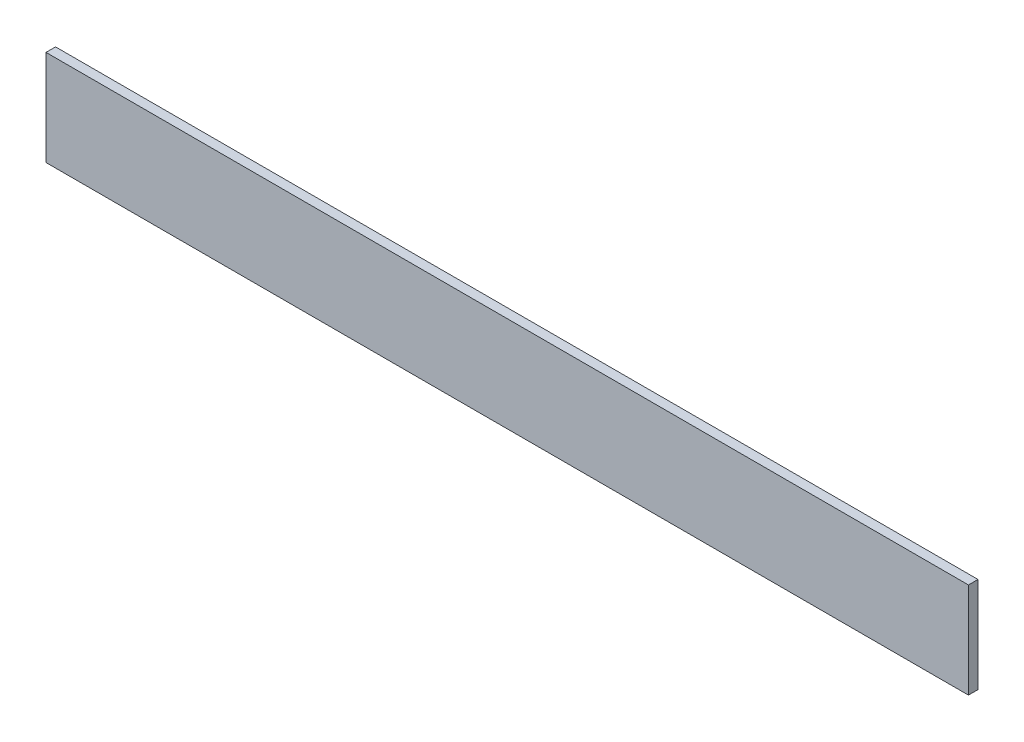
ISO-10303-21;
HEADER;
FILE_DESCRIPTION(('STEP AP214'),'2;1');
FILE_NAME('part.step','',(''),(''),'','','');
FILE_SCHEMA(('AUTOMOTIVE_DESIGN { 1 0 10303 214 1 1 1 1 }'));
ENDSEC;
DATA;
#1=APPLICATION_CONTEXT('core data for automotive mechanical design processes');
#2=APPLICATION_PROTOCOL_DEFINITION('international standard','automotive_design',2000,#1);
#3=PRODUCT_CONTEXT('',#1,'mechanical');
#4=PRODUCT('Part','Part','',(#3));
#5=PRODUCT_RELATED_PRODUCT_CATEGORY('part','',(#4));
#6=PRODUCT_DEFINITION_FORMATION('','',#4);
#7=PRODUCT_DEFINITION_CONTEXT('part definition',#1,'design');
#8=PRODUCT_DEFINITION('design','',#6,#7);
#9=PRODUCT_DEFINITION_SHAPE('','',#8);
#10=(LENGTH_UNIT() NAMED_UNIT(*) SI_UNIT(.MILLI.,.METRE.));
#11=(NAMED_UNIT(*) PLANE_ANGLE_UNIT() SI_UNIT($,.RADIAN.));
#12=(NAMED_UNIT(*) SI_UNIT($,.STERADIAN.) SOLID_ANGLE_UNIT());
#13=UNCERTAINTY_MEASURE_WITH_UNIT(LENGTH_MEASURE(1.E-05),#10,'distance_accuracy_value','');
#14=(GEOMETRIC_REPRESENTATION_CONTEXT(3) GLOBAL_UNCERTAINTY_ASSIGNED_CONTEXT((#13)) GLOBAL_UNIT_ASSIGNED_CONTEXT((#10,
#11,#12)) REPRESENTATION_CONTEXT('',''));
#15=CARTESIAN_POINT('',(0.,0.,0.));
#16=DIRECTION('',(0.,0.,1.));
#17=DIRECTION('',(1.,0.,0.));
#18=AXIS2_PLACEMENT_3D('',#15,#16,#17);
#19=CARTESIAN_POINT('',(0.,0.,0.9525));
#20=DIRECTION('',(0.,0.,1.));
#21=DIRECTION('',(1.,0.,0.));
#22=AXIS2_PLACEMENT_3D('',#19,#20,#21);
#23=PLANE('',#22);
#24=DIRECTION('',(0.,1.,0.));
#25=VECTOR('',#24,1.);
#26=CARTESIAN_POINT('',(-92.075,-9.525,0.9525));
#27=LINE('',#26,#25);
#28=CARTESIAN_POINT('',(-92.075,-9.525,0.9525));
#29=VERTEX_POINT('',#28);
#30=CARTESIAN_POINT('',(-92.075,9.525,0.9525));
#31=VERTEX_POINT('',#30);
#32=EDGE_CURVE('E68',#29,#31,#27,.T.);
#33=ORIENTED_EDGE('',*,*,#32,.F.);
#34=DIRECTION('',(1.,0.,0.));
#35=VECTOR('',#34,1.);
#36=CARTESIAN_POINT('',(92.075,-9.525,0.9525));
#37=LINE('',#36,#35);
#38=CARTESIAN_POINT('',(92.075,-9.525,0.9525));
#39=VERTEX_POINT('',#38);
#40=EDGE_CURVE('E20',#39,#29,#37,.F.);
#41=ORIENTED_EDGE('',*,*,#40,.F.);
#42=DIRECTION('',(0.,1.,0.));
#43=VECTOR('',#42,1.);
#44=CARTESIAN_POINT('',(92.075,9.525,0.9525));
#45=LINE('',#44,#43);
#46=CARTESIAN_POINT('',(92.075,9.525,0.9525));
#47=VERTEX_POINT('',#46);
#48=EDGE_CURVE('E58',#47,#39,#45,.F.);
#49=ORIENTED_EDGE('',*,*,#48,.F.);
#50=DIRECTION('',(1.,0.,0.));
#51=VECTOR('',#50,1.);
#52=CARTESIAN_POINT('',(-92.075,9.525,0.9525));
#53=LINE('',#52,#51);
#54=EDGE_CURVE('E53',#31,#47,#53,.T.);
#55=ORIENTED_EDGE('',*,*,#54,.F.);
#56=EDGE_LOOP('',(#33,#41,#49,#55));
#57=FACE_BOUND('',#56,.T.);
#58=ADVANCED_FACE('F17',(#57),#23,.T.);
#59=CARTESIAN_POINT('',(92.075,-9.525,0.));
#60=DIRECTION('',(0.,-1.,0.));
#61=DIRECTION('',(0.,0.,-1.));
#62=AXIS2_PLACEMENT_3D('',#59,#60,#61);
#63=PLANE('',#62);
#64=DIRECTION('',(1.,0.,0.));
#65=VECTOR('',#64,1.);
#66=CARTESIAN_POINT('',(0.,-9.525,-0.9525));
#67=LINE('',#66,#65);
#68=CARTESIAN_POINT('',(-92.075,-9.525,-0.9525));
#69=VERTEX_POINT('',#68);
#70=CARTESIAN_POINT('',(92.075,-9.525,-0.9525));
#71=VERTEX_POINT('',#70);
#72=EDGE_CURVE('E74',#69,#71,#67,.T.);
#73=ORIENTED_EDGE('',*,*,#72,.T.);
#74=DIRECTION('',(0.,0.,-1.));
#75=VECTOR('',#74,1.);
#76=CARTESIAN_POINT('',(92.075,-9.525,0.));
#77=LINE('',#76,#75);
#78=EDGE_CURVE('E63',#39,#71,#77,.T.);
#79=ORIENTED_EDGE('',*,*,#78,.F.);
#80=ORIENTED_EDGE('',*,*,#40,.T.);
#81=DIRECTION('',(0.,0.,1.));
#82=VECTOR('',#81,1.);
#83=CARTESIAN_POINT('',(-92.075,-9.525,0.));
#84=LINE('',#83,#82);
#85=EDGE_CURVE('E81',#69,#29,#84,.T.);
#86=ORIENTED_EDGE('',*,*,#85,.F.);
#87=EDGE_LOOP('',(#73,#79,#80,#86));
#88=FACE_BOUND('',#87,.T.);
#89=ADVANCED_FACE('F73',(#88),#63,.T.);
#90=CARTESIAN_POINT('',(92.075,9.525,0.));
#91=DIRECTION('',(1.,0.,0.));
#92=DIRECTION('',(0.,0.,-1.));
#93=AXIS2_PLACEMENT_3D('',#90,#91,#92);
#94=PLANE('',#93);
#95=DIRECTION('',(0.,1.,0.));
#96=VECTOR('',#95,1.);
#97=CARTESIAN_POINT('',(92.075,0.,-0.9525));
#98=LINE('',#97,#96);
#99=CARTESIAN_POINT('',(92.075,9.525,-0.9525));
#100=VERTEX_POINT('',#99);
#101=EDGE_CURVE('E84',#71,#100,#98,.T.);
#102=ORIENTED_EDGE('',*,*,#101,.T.);
#103=DIRECTION('',(0.,0.,1.));
#104=VECTOR('',#103,1.);
#105=CARTESIAN_POINT('',(92.075,9.525,0.));
#106=LINE('',#105,#104);
#107=EDGE_CURVE('E65',#47,#100,#106,.F.);
#108=ORIENTED_EDGE('',*,*,#107,.F.);
#109=ORIENTED_EDGE('',*,*,#48,.T.);
#110=ORIENTED_EDGE('',*,*,#78,.T.);
#111=EDGE_LOOP('',(#102,#108,#109,#110));
#112=FACE_BOUND('',#111,.T.);
#113=ADVANCED_FACE('F61',(#112),#94,.T.);
#114=CARTESIAN_POINT('',(-92.075,9.525,0.));
#115=DIRECTION('',(0.,1.,0.));
#116=DIRECTION('',(0.,0.,1.));
#117=AXIS2_PLACEMENT_3D('',#114,#115,#116);
#118=PLANE('',#117);
#119=DIRECTION('',(1.,0.,0.));
#120=VECTOR('',#119,1.);
#121=CARTESIAN_POINT('',(0.,9.525,-0.9525));
#122=LINE('',#121,#120);
#123=CARTESIAN_POINT('',(-92.075,9.525,-0.9525));
#124=VERTEX_POINT('',#123);
#125=EDGE_CURVE('E26',#100,#124,#122,.F.);
#126=ORIENTED_EDGE('',*,*,#125,.T.);
#127=DIRECTION('',(0.,0.,1.));
#128=VECTOR('',#127,1.);
#129=CARTESIAN_POINT('',(-92.075,9.525,0.));
#130=LINE('',#129,#128);
#131=EDGE_CURVE('E34',#31,#124,#130,.F.);
#132=ORIENTED_EDGE('',*,*,#131,.F.);
#133=ORIENTED_EDGE('',*,*,#54,.T.);
#134=ORIENTED_EDGE('',*,*,#107,.T.);
#135=EDGE_LOOP('',(#126,#132,#133,#134));
#136=FACE_BOUND('',#135,.T.);
#137=ADVANCED_FACE('F88',(#136),#118,.T.);
#138=CARTESIAN_POINT('',(-92.075,-9.525,0.));
#139=DIRECTION('',(-1.,0.,0.));
#140=DIRECTION('',(0.,0.,1.));
#141=AXIS2_PLACEMENT_3D('',#138,#139,#140);
#142=PLANE('',#141);
#143=DIRECTION('',(0.,1.,0.));
#144=VECTOR('',#143,1.);
#145=CARTESIAN_POINT('',(-92.075,0.,-0.9525));
#146=LINE('',#145,#144);
#147=EDGE_CURVE('E11',#124,#69,#146,.F.);
#148=ORIENTED_EDGE('',*,*,#147,.T.);
#149=ORIENTED_EDGE('',*,*,#85,.T.);
#150=ORIENTED_EDGE('',*,*,#32,.T.);
#151=ORIENTED_EDGE('',*,*,#131,.T.);
#152=EDGE_LOOP('',(#148,#149,#150,#151));
#153=FACE_BOUND('',#152,.T.);
#154=ADVANCED_FACE('F91',(#153),#142,.T.);
#155=CARTESIAN_POINT('',(0.,0.,-0.9525));
#156=DIRECTION('',(0.,0.,1.));
#157=DIRECTION('',(1.,0.,0.));
#158=AXIS2_PLACEMENT_3D('',#155,#156,#157);
#159=PLANE('',#158);
#160=ORIENTED_EDGE('',*,*,#125,.F.);
#161=ORIENTED_EDGE('',*,*,#101,.F.);
#162=ORIENTED_EDGE('',*,*,#72,.F.);
#163=ORIENTED_EDGE('',*,*,#147,.F.);
#164=EDGE_LOOP('',(#160,#161,#162,#163));
#165=FACE_BOUND('',#164,.T.);
#166=ADVANCED_FACE('F90',(#165),#159,.F.);
#167=CLOSED_SHELL('',(#58,#89,#113,#137,#154,#166));
#168=MANIFOLD_SOLID_BREP('B1',#167);
#169=ADVANCED_BREP_SHAPE_REPRESENTATION('',(#18,#168),#14);
#170=SHAPE_DEFINITION_REPRESENTATION(#9,#169);
ENDSEC;
END-ISO-10303-21;
